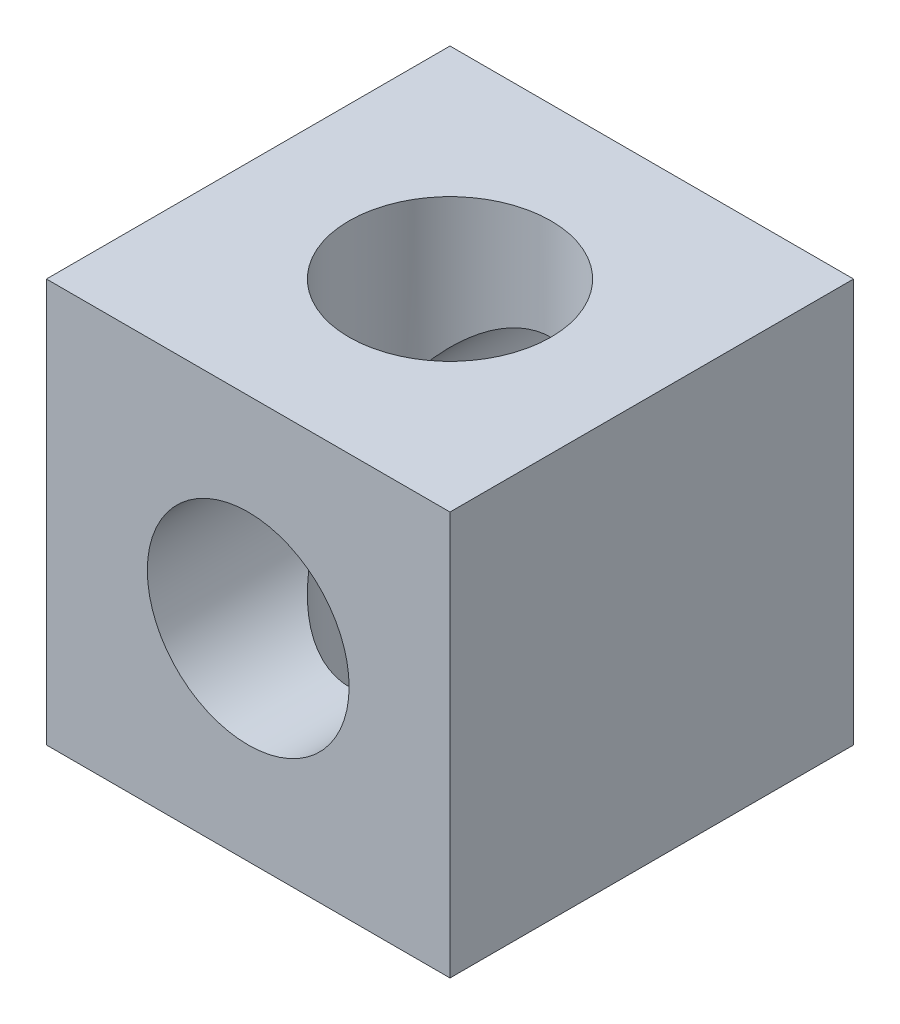
ISO-10303-21;
HEADER;
FILE_DESCRIPTION(('STEP AP214'),'2;1');
FILE_NAME('part.step','',(''),(''),'','','');
FILE_SCHEMA(('AUTOMOTIVE_DESIGN { 1 0 10303 214 1 1 1 1 }'));
ENDSEC;
DATA;
#1=APPLICATION_CONTEXT('core data for automotive mechanical design processes');
#2=APPLICATION_PROTOCOL_DEFINITION('international standard','automotive_design',2000,#1);
#3=PRODUCT_CONTEXT('',#1,'mechanical');
#4=PRODUCT('Part','Part','',(#3));
#5=PRODUCT_RELATED_PRODUCT_CATEGORY('part','',(#4));
#6=PRODUCT_DEFINITION_FORMATION('','',#4);
#7=PRODUCT_DEFINITION_CONTEXT('part definition',#1,'design');
#8=PRODUCT_DEFINITION('design','',#6,#7);
#9=PRODUCT_DEFINITION_SHAPE('','',#8);
#10=(LENGTH_UNIT() NAMED_UNIT(*) SI_UNIT(.MILLI.,.METRE.));
#11=(NAMED_UNIT(*) PLANE_ANGLE_UNIT() SI_UNIT($,.RADIAN.));
#12=(NAMED_UNIT(*) SI_UNIT($,.STERADIAN.) SOLID_ANGLE_UNIT());
#13=UNCERTAINTY_MEASURE_WITH_UNIT(LENGTH_MEASURE(1.E-05),#10,'distance_accuracy_value','');
#14=(GEOMETRIC_REPRESENTATION_CONTEXT(3) GLOBAL_UNCERTAINTY_ASSIGNED_CONTEXT((#13)) GLOBAL_UNIT_ASSIGNED_CONTEXT((#10,
#11,#12)) REPRESENTATION_CONTEXT('',''));
#15=CARTESIAN_POINT('',(0.,0.,0.));
#16=DIRECTION('',(0.,0.,1.));
#17=DIRECTION('',(1.,0.,0.));
#18=AXIS2_PLACEMENT_3D('',#15,#16,#17);
#19=CARTESIAN_POINT('',(0.,0.,-14.));
#20=DIRECTION('',(0.,0.,1.));
#21=DIRECTION('',(1.,0.,0.));
#22=AXIS2_PLACEMENT_3D('',#19,#20,#21);
#23=CYLINDRICAL_SURFACE('',#22,2.);
#24=CARTESIAN_POINT('',(0.,0.,8.));
#25=DIRECTION('',(0.,0.,1.));
#26=DIRECTION('',(1.,0.,0.));
#27=AXIS2_PLACEMENT_3D('',#24,#25,#26);
#28=CIRCLE('',#27,2.);
#29=CARTESIAN_POINT('',(2.,0.,8.));
#30=VERTEX_POINT('',#29);
#31=EDGE_CURVE('E98',#30,#30,#28,.T.);
#32=ORIENTED_EDGE('',*,*,#31,.T.);
#33=EDGE_LOOP('',(#32));
#34=FACE_BOUND('',#33,.T.);
#35=CARTESIAN_POINT('',(0.,0.,4.));
#36=DIRECTION('',(0.,-0.707106781186547,0.707106781186547));
#37=DIRECTION('',(0.,0.707106781186547,0.707106781186547));
#38=AXIS2_PLACEMENT_3D('',#35,#36,#37);
#39=ELLIPSE('',#38,2.82842712474619,2.);
#40=CARTESIAN_POINT('',(-2.,0.,4.));
#41=VERTEX_POINT('',#40);
#42=CARTESIAN_POINT('',(2.,0.,4.));
#43=VERTEX_POINT('',#42);
#44=EDGE_CURVE('E46',#41,#43,#39,.F.);
#45=ORIENTED_EDGE('',*,*,#44,.T.);
#46=CARTESIAN_POINT('',(0.,0.,4.));
#47=DIRECTION('',(0.,0.707106781186547,0.707106781186547));
#48=DIRECTION('',(0.,-0.707106781186547,0.707106781186547));
#49=AXIS2_PLACEMENT_3D('',#46,#47,#48);
#50=ELLIPSE('',#49,2.82842712474619,2.);
#51=EDGE_CURVE('E11',#43,#41,#50,.F.);
#52=ORIENTED_EDGE('',*,*,#51,.T.);
#53=EDGE_LOOP('',(#45,#52));
#54=FACE_BOUND('',#53,.T.);
#55=ADVANCED_FACE('F33',(#34,#54),#23,.F.);
#56=CARTESIAN_POINT('',(-4.,4.,8.));
#57=DIRECTION('',(1.,0.,0.));
#58=DIRECTION('',(0.,1.,0.));
#59=AXIS2_PLACEMENT_3D('',#56,#57,#58);
#60=PLANE('',#59);
#61=DIRECTION('',(0.,-1.,0.));
#62=VECTOR('',#61,1.);
#63=CARTESIAN_POINT('',(-4.,4.,0.));
#64=LINE('',#63,#62);
#65=CARTESIAN_POINT('',(-4.,4.,0.));
#66=VERTEX_POINT('',#65);
#67=CARTESIAN_POINT('',(-4.,-4.,0.));
#68=VERTEX_POINT('',#67);
#69=EDGE_CURVE('E97',#66,#68,#64,.T.);
#70=ORIENTED_EDGE('',*,*,#69,.T.);
#71=DIRECTION('',(0.,0.,-1.));
#72=VECTOR('',#71,1.);
#73=CARTESIAN_POINT('',(-4.,-4.,8.));
#74=LINE('',#73,#72);
#75=CARTESIAN_POINT('',(-4.,-4.,8.));
#76=VERTEX_POINT('',#75);
#77=EDGE_CURVE('E89',#76,#68,#74,.T.);
#78=ORIENTED_EDGE('',*,*,#77,.F.);
#79=DIRECTION('',(0.,-1.,0.));
#80=VECTOR('',#79,1.);
#81=CARTESIAN_POINT('',(-4.,4.,8.));
#82=LINE('',#81,#80);
#83=CARTESIAN_POINT('',(-4.,4.,8.));
#84=VERTEX_POINT('',#83);
#85=EDGE_CURVE('E115',#84,#76,#82,.T.);
#86=ORIENTED_EDGE('',*,*,#85,.F.);
#87=DIRECTION('',(0.,0.,-1.));
#88=VECTOR('',#87,1.);
#89=CARTESIAN_POINT('',(-4.,4.,8.));
#90=LINE('',#89,#88);
#91=EDGE_CURVE('E107',#84,#66,#90,.T.);
#92=ORIENTED_EDGE('',*,*,#91,.T.);
#93=EDGE_LOOP('',(#70,#78,#86,#92));
#94=FACE_BOUND('',#93,.T.);
#95=ADVANCED_FACE('F35',(#94),#60,.F.);
#96=CARTESIAN_POINT('',(-4.,-4.,8.));
#97=DIRECTION('',(0.,1.,0.));
#98=DIRECTION('',(0.,0.,1.));
#99=AXIS2_PLACEMENT_3D('',#96,#97,#98);
#100=PLANE('',#99);
#101=CARTESIAN_POINT('',(0.,-4.,4.));
#102=DIRECTION('',(0.,1.,0.));
#103=DIRECTION('',(0.,0.,1.));
#104=AXIS2_PLACEMENT_3D('',#101,#102,#103);
#105=CIRCLE('',#104,2.);
#106=CARTESIAN_POINT('',(0.,-4.,6.));
#107=VERTEX_POINT('',#106);
#108=EDGE_CURVE('E127',#107,#107,#105,.T.);
#109=ORIENTED_EDGE('',*,*,#108,.T.);
#110=EDGE_LOOP('',(#109));
#111=FACE_BOUND('',#110,.T.);
#112=DIRECTION('',(1.,0.,0.));
#113=VECTOR('',#112,1.);
#114=CARTESIAN_POINT('',(-4.,-4.,0.));
#115=LINE('',#114,#113);
#116=CARTESIAN_POINT('',(4.,-4.,0.));
#117=VERTEX_POINT('',#116);
#118=EDGE_CURVE('E121',#68,#117,#115,.T.);
#119=ORIENTED_EDGE('',*,*,#118,.T.);
#120=DIRECTION('',(0.,0.,-1.));
#121=VECTOR('',#120,1.);
#122=CARTESIAN_POINT('',(4.,-4.,8.));
#123=LINE('',#122,#121);
#124=CARTESIAN_POINT('',(4.,-4.,8.));
#125=VERTEX_POINT('',#124);
#126=EDGE_CURVE('E101',#125,#117,#123,.T.);
#127=ORIENTED_EDGE('',*,*,#126,.F.);
#128=DIRECTION('',(1.,0.,0.));
#129=VECTOR('',#128,1.);
#130=CARTESIAN_POINT('',(-4.,-4.,8.));
#131=LINE('',#130,#129);
#132=EDGE_CURVE('E113',#76,#125,#131,.T.);
#133=ORIENTED_EDGE('',*,*,#132,.F.);
#134=ORIENTED_EDGE('',*,*,#77,.T.);
#135=EDGE_LOOP('',(#119,#127,#133,#134));
#136=FACE_BOUND('',#135,.T.);
#137=ADVANCED_FACE('F152',(#111,#136),#100,.F.);
#138=CARTESIAN_POINT('',(4.,4.,8.));
#139=DIRECTION('',(-1.,0.,0.));
#140=DIRECTION('',(0.,-1.,0.));
#141=AXIS2_PLACEMENT_3D('',#138,#139,#140);
#142=PLANE('',#141);
#143=DIRECTION('',(0.,1.,0.));
#144=VECTOR('',#143,1.);
#145=CARTESIAN_POINT('',(4.,4.,0.));
#146=LINE('',#145,#144);
#147=CARTESIAN_POINT('',(4.,4.,0.));
#148=VERTEX_POINT('',#147);
#149=EDGE_CURVE('E119',#117,#148,#146,.T.);
#150=ORIENTED_EDGE('',*,*,#149,.T.);
#151=DIRECTION('',(0.,0.,-1.));
#152=VECTOR('',#151,1.);
#153=CARTESIAN_POINT('',(4.,4.,8.));
#154=LINE('',#153,#152);
#155=CARTESIAN_POINT('',(4.,4.,8.));
#156=VERTEX_POINT('',#155);
#157=EDGE_CURVE('E104',#156,#148,#154,.T.);
#158=ORIENTED_EDGE('',*,*,#157,.F.);
#159=DIRECTION('',(0.,1.,0.));
#160=VECTOR('',#159,1.);
#161=CARTESIAN_POINT('',(4.,4.,8.));
#162=LINE('',#161,#160);
#163=EDGE_CURVE('E111',#125,#156,#162,.T.);
#164=ORIENTED_EDGE('',*,*,#163,.F.);
#165=ORIENTED_EDGE('',*,*,#126,.T.);
#166=EDGE_LOOP('',(#150,#158,#164,#165));
#167=FACE_BOUND('',#166,.T.);
#168=ADVANCED_FACE('F139',(#167),#142,.F.);
#169=CARTESIAN_POINT('',(-4.,4.,8.));
#170=DIRECTION('',(0.,-1.,0.));
#171=DIRECTION('',(0.,0.,-1.));
#172=AXIS2_PLACEMENT_3D('',#169,#170,#171);
#173=PLANE('',#172);
#174=CARTESIAN_POINT('',(0.,4.,4.));
#175=DIRECTION('',(0.,1.,0.));
#176=DIRECTION('',(0.,0.,1.));
#177=AXIS2_PLACEMENT_3D('',#174,#175,#176);
#178=CIRCLE('',#177,2.);
#179=CARTESIAN_POINT('',(0.,4.,6.));
#180=VERTEX_POINT('',#179);
#181=EDGE_CURVE('E130',#180,#180,#178,.T.);
#182=ORIENTED_EDGE('',*,*,#181,.F.);
#183=EDGE_LOOP('',(#182));
#184=FACE_BOUND('',#183,.T.);
#185=DIRECTION('',(-1.,0.,0.));
#186=VECTOR('',#185,1.);
#187=CARTESIAN_POINT('',(-4.,4.,0.));
#188=LINE('',#187,#186);
#189=EDGE_CURVE('E117',#148,#66,#188,.T.);
#190=ORIENTED_EDGE('',*,*,#189,.T.);
#191=ORIENTED_EDGE('',*,*,#91,.F.);
#192=DIRECTION('',(-1.,0.,0.));
#193=VECTOR('',#192,1.);
#194=CARTESIAN_POINT('',(-4.,4.,8.));
#195=LINE('',#194,#193);
#196=EDGE_CURVE('E54',#156,#84,#195,.T.);
#197=ORIENTED_EDGE('',*,*,#196,.F.);
#198=ORIENTED_EDGE('',*,*,#157,.T.);
#199=EDGE_LOOP('',(#190,#191,#197,#198));
#200=FACE_BOUND('',#199,.T.);
#201=ADVANCED_FACE('F135',(#184,#200),#173,.F.);
#202=CARTESIAN_POINT('',(-4.,-4.,8.));
#203=DIRECTION('',(0.,0.,1.));
#204=DIRECTION('',(1.,0.,0.));
#205=AXIS2_PLACEMENT_3D('',#202,#203,#204);
#206=PLANE('',#205);
#207=ORIENTED_EDGE('',*,*,#31,.F.);
#208=EDGE_LOOP('',(#207));
#209=FACE_BOUND('',#208,.T.);
#210=ORIENTED_EDGE('',*,*,#85,.T.);
#211=ORIENTED_EDGE('',*,*,#132,.T.);
#212=ORIENTED_EDGE('',*,*,#163,.T.);
#213=ORIENTED_EDGE('',*,*,#196,.T.);
#214=EDGE_LOOP('',(#210,#211,#212,#213));
#215=FACE_BOUND('',#214,.T.);
#216=ADVANCED_FACE('F138',(#209,#215),#206,.T.);
#217=CARTESIAN_POINT('',(-4.,-4.,0.));
#218=DIRECTION('',(0.,0.,1.));
#219=DIRECTION('',(1.,0.,0.));
#220=AXIS2_PLACEMENT_3D('',#217,#218,#219);
#221=PLANE('',#220);
#222=CARTESIAN_POINT('',(0.,0.,0.));
#223=DIRECTION('',(0.,0.,1.));
#224=DIRECTION('',(1.,0.,0.));
#225=AXIS2_PLACEMENT_3D('',#222,#223,#224);
#226=CIRCLE('',#225,2.);
#227=CARTESIAN_POINT('',(2.,0.,0.));
#228=VERTEX_POINT('',#227);
#229=EDGE_CURVE('E94',#228,#228,#226,.T.);
#230=ORIENTED_EDGE('',*,*,#229,.T.);
#231=EDGE_LOOP('',(#230));
#232=FACE_BOUND('',#231,.T.);
#233=ORIENTED_EDGE('',*,*,#69,.F.);
#234=ORIENTED_EDGE('',*,*,#189,.F.);
#235=ORIENTED_EDGE('',*,*,#149,.F.);
#236=ORIENTED_EDGE('',*,*,#118,.F.);
#237=EDGE_LOOP('',(#233,#234,#235,#236));
#238=FACE_BOUND('',#237,.T.);
#239=ADVANCED_FACE('F149',(#232,#238),#221,.F.);
#240=CARTESIAN_POINT('',(0.,0.,4.));
#241=DIRECTION('',(0.,-0.707106781186547,0.707106781186547));
#242=DIRECTION('',(0.,0.707106781186547,0.707106781186547));
#243=AXIS2_PLACEMENT_3D('',#240,#241,#242);
#244=ELLIPSE('',#243,2.82842712474619,2.);
#245=EDGE_CURVE('E81',#41,#43,#244,.T.);
#246=ORIENTED_EDGE('',*,*,#245,.T.);
#247=CARTESIAN_POINT('',(0.,0.,4.));
#248=DIRECTION('',(0.,0.707106781186547,0.707106781186547));
#249=DIRECTION('',(0.,-0.707106781186547,0.707106781186547));
#250=AXIS2_PLACEMENT_3D('',#247,#248,#249);
#251=ELLIPSE('',#250,2.82842712474619,2.);
#252=EDGE_CURVE('E41',#43,#41,#251,.T.);
#253=ORIENTED_EDGE('',*,*,#252,.T.);
#254=EDGE_LOOP('',(#246,#253));
#255=FACE_BOUND('',#254,.T.);
#256=ORIENTED_EDGE('',*,*,#229,.F.);
#257=EDGE_LOOP('',(#256));
#258=FACE_BOUND('',#257,.T.);
#259=ADVANCED_FACE('F91',(#255,#258),#23,.F.);
#260=CARTESIAN_POINT('',(0.,-18.,4.));
#261=DIRECTION('',(0.,1.,0.));
#262=DIRECTION('',(0.,0.,1.));
#263=AXIS2_PLACEMENT_3D('',#260,#261,#262);
#264=CYLINDRICAL_SURFACE('',#263,2.);
#265=ORIENTED_EDGE('',*,*,#181,.T.);
#266=EDGE_LOOP('',(#265));
#267=FACE_BOUND('',#266,.T.);
#268=ORIENTED_EDGE('',*,*,#44,.F.);
#269=ORIENTED_EDGE('',*,*,#252,.F.);
#270=EDGE_LOOP('',(#268,#269));
#271=FACE_BOUND('',#270,.T.);
#272=ADVANCED_FACE('F88',(#267,#271),#264,.F.);
#273=ORIENTED_EDGE('',*,*,#245,.F.);
#274=ORIENTED_EDGE('',*,*,#51,.F.);
#275=EDGE_LOOP('',(#273,#274));
#276=FACE_BOUND('',#275,.T.);
#277=ORIENTED_EDGE('',*,*,#108,.F.);
#278=EDGE_LOOP('',(#277));
#279=FACE_BOUND('',#278,.T.);
#280=ADVANCED_FACE('F82',(#276,#279),#264,.F.);
#281=CLOSED_SHELL('',(#55,#95,#137,#168,#201,#216,#239,#259,#272,#280));
#282=MANIFOLD_SOLID_BREP('B2',#281);
#283=ADVANCED_BREP_SHAPE_REPRESENTATION('',(#18,#282),#14);
#284=SHAPE_DEFINITION_REPRESENTATION(#9,#283);
ENDSEC;
END-ISO-10303-21;
